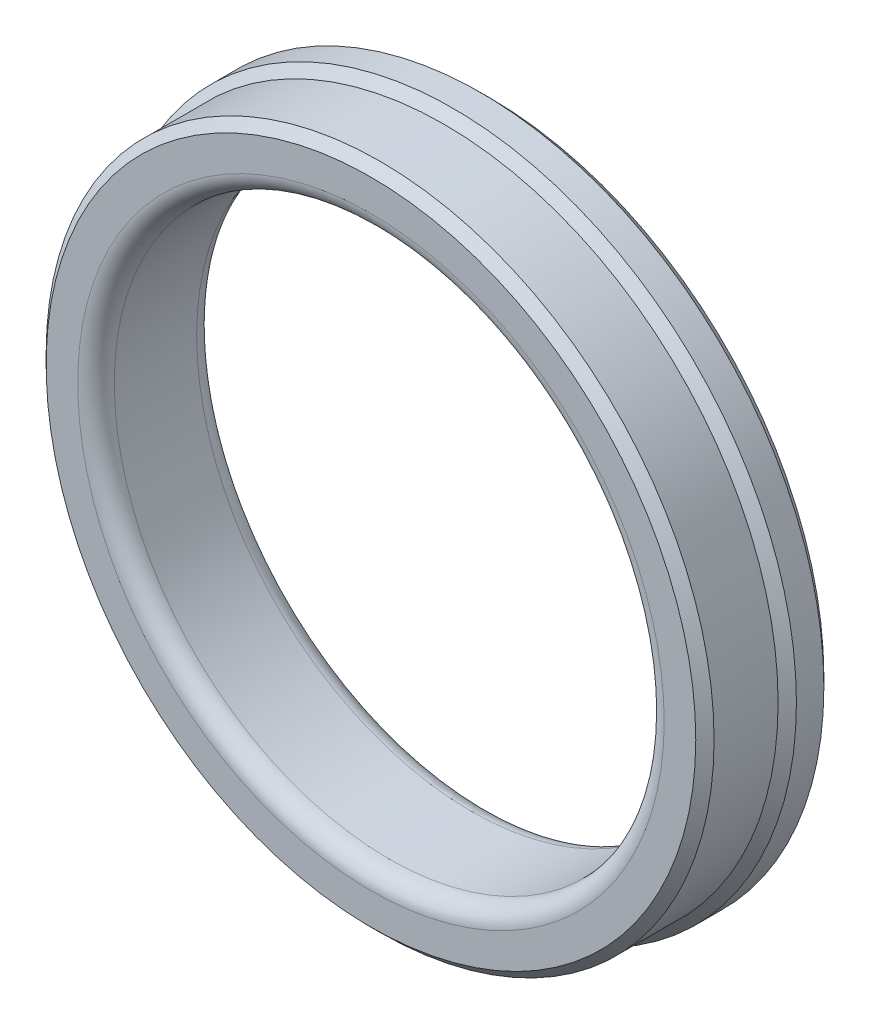
ISO-10303-21;
HEADER;
FILE_DESCRIPTION(('STEP AP214'),'2;1');
FILE_NAME('part.step','',(''),(''),'','','');
FILE_SCHEMA(('AUTOMOTIVE_DESIGN { 1 0 10303 214 1 1 1 1 }'));
ENDSEC;
DATA;
#1=APPLICATION_CONTEXT('core data for automotive mechanical design processes');
#2=APPLICATION_PROTOCOL_DEFINITION('international standard','automotive_design',2000,#1);
#3=PRODUCT_CONTEXT('',#1,'mechanical');
#4=PRODUCT('Part','Part','',(#3));
#5=PRODUCT_RELATED_PRODUCT_CATEGORY('part','',(#4));
#6=PRODUCT_DEFINITION_FORMATION('','',#4);
#7=PRODUCT_DEFINITION_CONTEXT('part definition',#1,'design');
#8=PRODUCT_DEFINITION('design','',#6,#7);
#9=PRODUCT_DEFINITION_SHAPE('','',#8);
#10=(LENGTH_UNIT() NAMED_UNIT(*) SI_UNIT(.MILLI.,.METRE.));
#11=(NAMED_UNIT(*) PLANE_ANGLE_UNIT() SI_UNIT($,.RADIAN.));
#12=(NAMED_UNIT(*) SI_UNIT($,.STERADIAN.) SOLID_ANGLE_UNIT());
#13=UNCERTAINTY_MEASURE_WITH_UNIT(LENGTH_MEASURE(1.E-05),#10,'distance_accuracy_value','');
#14=(GEOMETRIC_REPRESENTATION_CONTEXT(3) GLOBAL_UNCERTAINTY_ASSIGNED_CONTEXT((#13)) GLOBAL_UNIT_ASSIGNED_CONTEXT((#10,
#11,#12)) REPRESENTATION_CONTEXT('',''));
#15=CARTESIAN_POINT('',(0.,0.,0.));
#16=DIRECTION('',(0.,0.,1.));
#17=DIRECTION('',(1.,0.,0.));
#18=AXIS2_PLACEMENT_3D('',#15,#16,#17);
#19=CARTESIAN_POINT('',(0.,0.,0.));
#20=DIRECTION('',(0.,0.,1.));
#21=DIRECTION('',(1.,0.,0.));
#22=AXIS2_PLACEMENT_3D('',#19,#20,#21);
#23=PLANE('',#22);
#24=CARTESIAN_POINT('',(0.,0.,0.));
#25=DIRECTION('',(0.,0.,1.));
#26=DIRECTION('',(1.,0.,0.));
#27=AXIS2_PLACEMENT_3D('',#24,#25,#26);
#28=CIRCLE('',#27,32.05);
#29=CARTESIAN_POINT('',(32.05,0.,0.));
#30=VERTEX_POINT('',#29);
#31=EDGE_CURVE('E10',#30,#30,#28,.T.);
#32=ORIENTED_EDGE('',*,*,#31,.T.);
#33=EDGE_LOOP('',(#32));
#34=FACE_BOUND('',#33,.T.);
#35=CARTESIAN_POINT('',(0.,0.,0.));
#36=DIRECTION('',(0.,0.,1.));
#37=DIRECTION('',(1.,0.,0.));
#38=AXIS2_PLACEMENT_3D('',#35,#36,#37);
#39=CIRCLE('',#38,36.5);
#40=CARTESIAN_POINT('',(36.5,0.,0.));
#41=VERTEX_POINT('',#40);
#42=EDGE_CURVE('E71',#41,#41,#39,.F.);
#43=ORIENTED_EDGE('',*,*,#42,.T.);
#44=EDGE_LOOP('',(#43));
#45=FACE_BOUND('',#44,.T.);
#46=ADVANCED_FACE('F39',(#34,#45),#23,.F.);
#47=CARTESIAN_POINT('',(0.,0.,5.));
#48=DIRECTION('',(0.,0.,-1.));
#49=DIRECTION('',(-1.,0.,0.));
#50=AXIS2_PLACEMENT_3D('',#47,#48,#49);
#51=CYLINDRICAL_SURFACE('',#50,37.5);
#52=CARTESIAN_POINT('',(0.,0.,1.));
#53=DIRECTION('',(0.,0.,1.));
#54=DIRECTION('',(1.,0.,0.));
#55=AXIS2_PLACEMENT_3D('',#52,#53,#54);
#56=CIRCLE('',#55,37.5);
#57=CARTESIAN_POINT('',(37.5,0.,1.));
#58=VERTEX_POINT('',#57);
#59=EDGE_CURVE('E75',#58,#58,#56,.T.);
#60=ORIENTED_EDGE('',*,*,#59,.T.);
#61=EDGE_LOOP('',(#60));
#62=FACE_BOUND('',#61,.T.);
#63=CARTESIAN_POINT('',(0.,0.,3.99999999999997));
#64=DIRECTION('',(0.,0.,1.));
#65=DIRECTION('',(1.,0.,0.));
#66=AXIS2_PLACEMENT_3D('',#63,#64,#65);
#67=CIRCLE('',#66,37.5);
#68=CARTESIAN_POINT('',(37.5,0.,3.99999999999997));
#69=VERTEX_POINT('',#68);
#70=EDGE_CURVE('E79',#69,#69,#67,.F.);
#71=ORIENTED_EDGE('',*,*,#70,.T.);
#72=EDGE_LOOP('',(#71));
#73=FACE_BOUND('',#72,.T.);
#74=ADVANCED_FACE('F107',(#62,#73),#51,.T.);
#75=CARTESIAN_POINT('',(0.,0.,5.));
#76=DIRECTION('',(0.,0.,-1.));
#77=DIRECTION('',(-1.,0.,0.));
#78=AXIS2_PLACEMENT_3D('',#75,#76,#77);
#79=CYLINDRICAL_SURFACE('',#78,30.05);
#80=CARTESIAN_POINT('',(0.,0.,11.));
#81=DIRECTION('',(0.,0.,1.));
#82=DIRECTION('',(1.,0.,0.));
#83=AXIS2_PLACEMENT_3D('',#80,#81,#82);
#84=CIRCLE('',#83,30.05);
#85=CARTESIAN_POINT('',(30.05,0.,11.));
#86=VERTEX_POINT('',#85);
#87=EDGE_CURVE('E52',#86,#86,#84,.T.);
#88=ORIENTED_EDGE('',*,*,#87,.T.);
#89=EDGE_LOOP('',(#88));
#90=FACE_BOUND('',#89,.T.);
#91=CARTESIAN_POINT('',(0.,0.,2.));
#92=DIRECTION('',(0.,0.,1.));
#93=DIRECTION('',(1.,0.,0.));
#94=AXIS2_PLACEMENT_3D('',#91,#92,#93);
#95=CIRCLE('',#94,30.05);
#96=CARTESIAN_POINT('',(30.05,0.,2.));
#97=VERTEX_POINT('',#96);
#98=EDGE_CURVE('E57',#97,#97,#95,.F.);
#99=ORIENTED_EDGE('',*,*,#98,.T.);
#100=EDGE_LOOP('',(#99));
#101=FACE_BOUND('',#100,.T.);
#102=ADVANCED_FACE('F112',(#90,#101),#79,.F.);
#103=CARTESIAN_POINT('',(0.,0.,13.));
#104=DIRECTION('',(0.,0.,1.));
#105=DIRECTION('',(1.,0.,0.));
#106=AXIS2_PLACEMENT_3D('',#103,#104,#105);
#107=PLANE('',#106);
#108=CARTESIAN_POINT('',(0.,0.,13.));
#109=DIRECTION('',(0.,0.,1.));
#110=DIRECTION('',(1.,0.,0.));
#111=AXIS2_PLACEMENT_3D('',#108,#109,#110);
#112=CIRCLE('',#111,32.05);
#113=CARTESIAN_POINT('',(32.05,0.,13.));
#114=VERTEX_POINT('',#113);
#115=EDGE_CURVE('E47',#114,#114,#112,.F.);
#116=ORIENTED_EDGE('',*,*,#115,.T.);
#117=EDGE_LOOP('',(#116));
#118=FACE_BOUND('',#117,.T.);
#119=CARTESIAN_POINT('',(0.,0.,13.));
#120=DIRECTION('',(0.,0.,1.));
#121=DIRECTION('',(1.,0.,0.));
#122=AXIS2_PLACEMENT_3D('',#119,#120,#121);
#123=CIRCLE('',#122,35.5);
#124=CARTESIAN_POINT('',(35.5,0.,13.));
#125=VERTEX_POINT('',#124);
#126=EDGE_CURVE('E67',#125,#125,#123,.T.);
#127=ORIENTED_EDGE('',*,*,#126,.T.);
#128=EDGE_LOOP('',(#127));
#129=FACE_BOUND('',#128,.T.);
#130=ADVANCED_FACE('F132',(#118,#129),#107,.T.);
#131=CARTESIAN_POINT('',(0.,0.,13.));
#132=DIRECTION('',(0.,0.,-1.));
#133=DIRECTION('',(-1.,0.,0.));
#134=AXIS2_PLACEMENT_3D('',#131,#132,#133);
#135=CYLINDRICAL_SURFACE('',#134,36.5);
#136=CARTESIAN_POINT('',(0.,0.,12.));
#137=DIRECTION('',(0.,0.,1.));
#138=DIRECTION('',(1.,0.,0.));
#139=AXIS2_PLACEMENT_3D('',#136,#137,#138);
#140=CIRCLE('',#139,36.5);
#141=CARTESIAN_POINT('',(36.5,0.,12.));
#142=VERTEX_POINT('',#141);
#143=EDGE_CURVE('E63',#142,#142,#140,.F.);
#144=ORIENTED_EDGE('',*,*,#143,.T.);
#145=EDGE_LOOP('',(#144));
#146=FACE_BOUND('',#145,.T.);
#147=CARTESIAN_POINT('',(0.,0.,5.));
#148=DIRECTION('',(0.,0.,1.));
#149=DIRECTION('',(1.,0.,0.));
#150=AXIS2_PLACEMENT_3D('',#147,#148,#149);
#151=CIRCLE('',#150,36.5);
#152=CARTESIAN_POINT('',(36.5,0.,5.));
#153=VERTEX_POINT('',#152);
#154=EDGE_CURVE('E83',#153,#153,#151,.T.);
#155=ORIENTED_EDGE('',*,*,#154,.T.);
#156=EDGE_LOOP('',(#155));
#157=FACE_BOUND('',#156,.T.);
#158=ADVANCED_FACE('F88',(#146,#157),#135,.T.);
#159=CARTESIAN_POINT('',(0.,0.,1.));
#160=DIRECTION('',(0.,0.,1.));
#161=DIRECTION('',(1.,0.,0.));
#162=AXIS2_PLACEMENT_3D('',#159,#160,#161);
#163=CONICAL_SURFACE('',#162,37.5,0.785398163397452);
#164=ORIENTED_EDGE('',*,*,#42,.F.);
#165=EDGE_LOOP('',(#164));
#166=FACE_BOUND('',#165,.T.);
#167=ORIENTED_EDGE('',*,*,#59,.F.);
#168=EDGE_LOOP('',(#167));
#169=FACE_BOUND('',#168,.T.);
#170=ADVANCED_FACE('F101',(#166,#169),#163,.T.);
#171=CARTESIAN_POINT('',(0.,0.,13.));
#172=DIRECTION('',(0.,0.,-1.));
#173=DIRECTION('',(-1.,0.,0.));
#174=AXIS2_PLACEMENT_3D('',#171,#172,#173);
#175=CONICAL_SURFACE('',#174,35.5,0.785398163397438);
#176=ORIENTED_EDGE('',*,*,#143,.F.);
#177=EDGE_LOOP('',(#176));
#178=FACE_BOUND('',#177,.T.);
#179=ORIENTED_EDGE('',*,*,#126,.F.);
#180=EDGE_LOOP('',(#179));
#181=FACE_BOUND('',#180,.T.);
#182=ADVANCED_FACE('F93',(#178,#181),#175,.T.);
#183=CARTESIAN_POINT('',(0.,0.,5.));
#184=DIRECTION('',(0.,0.,-1.));
#185=DIRECTION('',(-1.,0.,0.));
#186=AXIS2_PLACEMENT_3D('',#183,#184,#185);
#187=CONICAL_SURFACE('',#186,36.5,0.785398163397448);
#188=ORIENTED_EDGE('',*,*,#70,.F.);
#189=EDGE_LOOP('',(#188));
#190=FACE_BOUND('',#189,.T.);
#191=ORIENTED_EDGE('',*,*,#154,.F.);
#192=EDGE_LOOP('',(#191));
#193=FACE_BOUND('',#192,.T.);
#194=ADVANCED_FACE('F90',(#190,#193),#187,.T.);
#195=CARTESIAN_POINT('',(0.,0.,11.));
#196=DIRECTION('',(0.,0.,1.));
#197=DIRECTION('',(1.,0.,0.));
#198=AXIS2_PLACEMENT_3D('',#195,#196,#197);
#199=TOROIDAL_SURFACE('',#198,32.05,2.);
#200=ORIENTED_EDGE('',*,*,#115,.F.);
#201=EDGE_LOOP('',(#200));
#202=FACE_BOUND('',#201,.T.);
#203=ORIENTED_EDGE('',*,*,#87,.F.);
#204=EDGE_LOOP('',(#203));
#205=FACE_BOUND('',#204,.T.);
#206=ADVANCED_FACE('F92',(#202,#205),#199,.T.);
#207=CARTESIAN_POINT('',(0.,0.,2.));
#208=DIRECTION('',(0.,0.,1.));
#209=DIRECTION('',(1.,0.,0.));
#210=AXIS2_PLACEMENT_3D('',#207,#208,#209);
#211=TOROIDAL_SURFACE('',#210,32.05,2.);
#212=ORIENTED_EDGE('',*,*,#98,.F.);
#213=EDGE_LOOP('',(#212));
#214=FACE_BOUND('',#213,.T.);
#215=ORIENTED_EDGE('',*,*,#31,.F.);
#216=EDGE_LOOP('',(#215));
#217=FACE_BOUND('',#216,.T.);
#218=ADVANCED_FACE('F41',(#214,#217),#211,.T.);
#219=CLOSED_SHELL('',(#46,#74,#102,#130,#158,#170,#182,#194,#206,#218));
#220=MANIFOLD_SOLID_BREP('B2',#219);
#221=ADVANCED_BREP_SHAPE_REPRESENTATION('',(#18,#220),#14);
#222=SHAPE_DEFINITION_REPRESENTATION(#9,#221);
ENDSEC;
END-ISO-10303-21;
